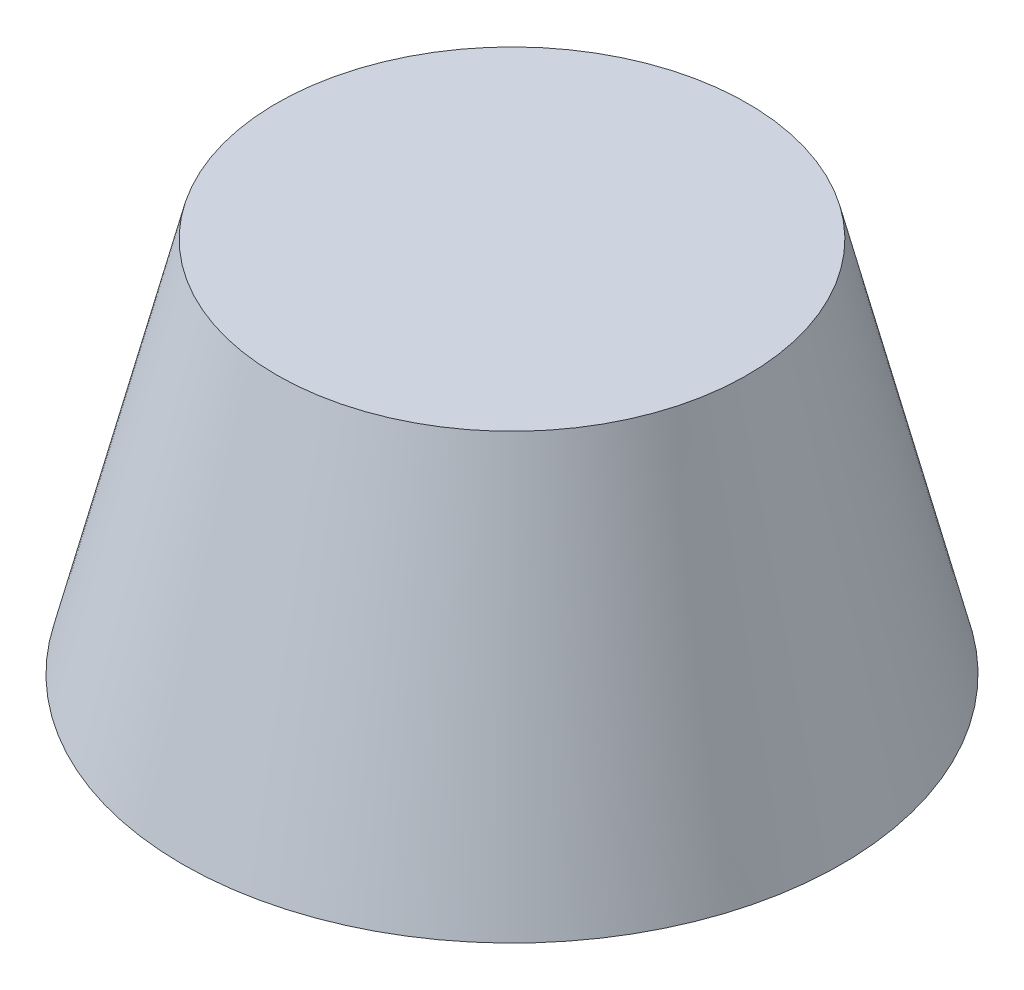
ISO-10303-21;
HEADER;
FILE_DESCRIPTION(('STEP AP214'),'2;1');
FILE_NAME('part.step','',(''),(''),'','','');
FILE_SCHEMA(('AUTOMOTIVE_DESIGN { 1 0 10303 214 1 1 1 1 }'));
ENDSEC;
DATA;
#1=APPLICATION_CONTEXT('core data for automotive mechanical design processes');
#2=APPLICATION_PROTOCOL_DEFINITION('international standard','automotive_design',2000,#1);
#3=PRODUCT_CONTEXT('',#1,'mechanical');
#4=PRODUCT('Part','Part','',(#3));
#5=PRODUCT_RELATED_PRODUCT_CATEGORY('part','',(#4));
#6=PRODUCT_DEFINITION_FORMATION('','',#4);
#7=PRODUCT_DEFINITION_CONTEXT('part definition',#1,'design');
#8=PRODUCT_DEFINITION('design','',#6,#7);
#9=PRODUCT_DEFINITION_SHAPE('','',#8);
#10=(LENGTH_UNIT() NAMED_UNIT(*) SI_UNIT(.MILLI.,.METRE.));
#11=(NAMED_UNIT(*) PLANE_ANGLE_UNIT() SI_UNIT($,.RADIAN.));
#12=(NAMED_UNIT(*) SI_UNIT($,.STERADIAN.) SOLID_ANGLE_UNIT());
#13=UNCERTAINTY_MEASURE_WITH_UNIT(LENGTH_MEASURE(1.E-05),#10,'distance_accuracy_value','');
#14=(GEOMETRIC_REPRESENTATION_CONTEXT(3) GLOBAL_UNCERTAINTY_ASSIGNED_CONTEXT((#13)) GLOBAL_UNIT_ASSIGNED_CONTEXT((#10,
#11,#12)) REPRESENTATION_CONTEXT('',''));
#15=CARTESIAN_POINT('',(0.,0.,0.));
#16=DIRECTION('',(0.,0.,1.));
#17=DIRECTION('',(1.,0.,0.));
#18=AXIS2_PLACEMENT_3D('',#15,#16,#17);
#19=CARTESIAN_POINT('',(0.,25.4,0.));
#20=DIRECTION('',(0.,1.,0.));
#21=DIRECTION('',(0.,0.,1.));
#22=AXIS2_PLACEMENT_3D('',#19,#20,#21);
#23=PLANE('',#22);
#24=CARTESIAN_POINT('',(0.,25.4,0.));
#25=DIRECTION('',(0.,1.,0.));
#26=DIRECTION('',(0.,0.,1.));
#27=AXIS2_PLACEMENT_3D('',#24,#25,#26);
#28=CIRCLE('',#27,15.875);
#29=CARTESIAN_POINT('',(0.,25.4,15.875));
#30=VERTEX_POINT('',#29);
#31=EDGE_CURVE('E45',#30,#30,#28,.T.);
#32=ORIENTED_EDGE('',*,*,#31,.T.);
#33=EDGE_LOOP('',(#32));
#34=FACE_BOUND('',#33,.T.);
#35=ADVANCED_FACE('F37',(#34),#23,.T.);
#36=CARTESIAN_POINT('',(0.,0.,0.));
#37=DIRECTION('',(0.,1.,0.));
#38=DIRECTION('',(0.,0.,1.));
#39=AXIS2_PLACEMENT_3D('',#36,#37,#38);
#40=PLANE('',#39);
#41=CARTESIAN_POINT('',(0.,0.,0.));
#42=DIRECTION('',(0.,1.,0.));
#43=DIRECTION('',(0.,0.,1.));
#44=AXIS2_PLACEMENT_3D('',#41,#42,#43);
#45=CIRCLE('',#44,22.225);
#46=CARTESIAN_POINT('',(0.,0.,22.225));
#47=VERTEX_POINT('',#46);
#48=EDGE_CURVE('E11',#47,#47,#45,.T.);
#49=ORIENTED_EDGE('',*,*,#48,.F.);
#50=EDGE_LOOP('',(#49));
#51=FACE_BOUND('',#50,.T.);
#52=ADVANCED_FACE('F85',(#51),#40,.F.);
#53=CARTESIAN_POINT('',(0.,25.4,0.));
#54=DIRECTION('',(0.,-1.,0.));
#55=DIRECTION('',(0.,0.,-1.));
#56=AXIS2_PLACEMENT_3D('',#53,#54,#55);
#57=CONICAL_SURFACE('',#56,15.875,0.244978663126864);
#58=ORIENTED_EDGE('',*,*,#48,.T.);
#59=EDGE_LOOP('',(#58));
#60=FACE_BOUND('',#59,.T.);
#61=ORIENTED_EDGE('',*,*,#31,.F.);
#62=EDGE_LOOP('',(#61));
#63=FACE_BOUND('',#62,.T.);
#64=ADVANCED_FACE('F71',(#60,#63),#57,.T.);
#65=CLOSED_SHELL('',(#35,#52,#64));
#66=MANIFOLD_SOLID_BREP('B2',#65);
#67=ADVANCED_BREP_SHAPE_REPRESENTATION('',(#18,#66),#14);
#68=SHAPE_DEFINITION_REPRESENTATION(#9,#67);
ENDSEC;
END-ISO-10303-21;
